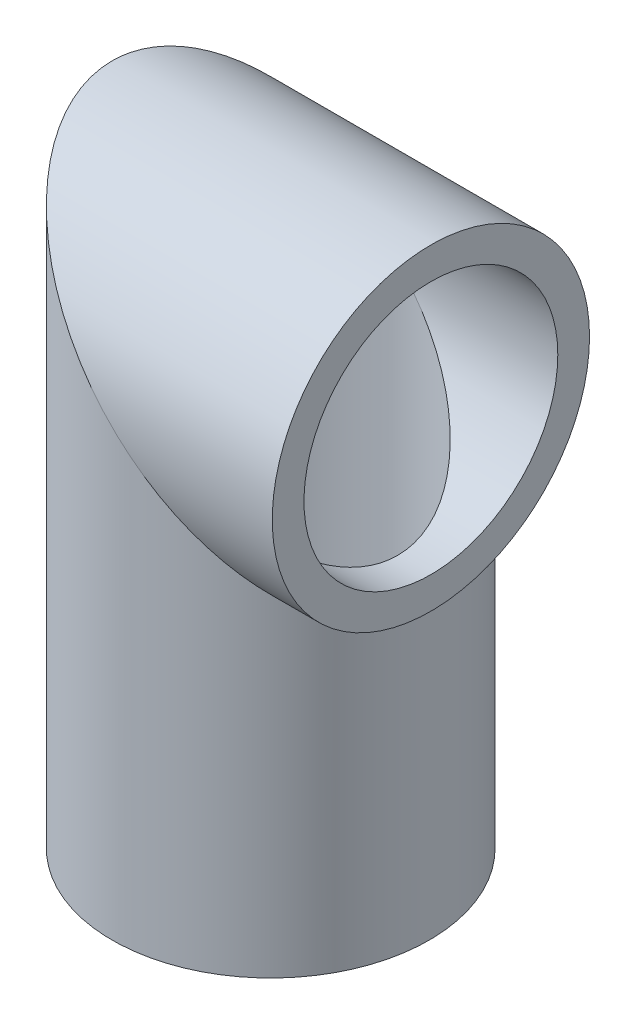
ISO-10303-21;
HEADER;
FILE_DESCRIPTION(('STEP AP214'),'2;1');
FILE_NAME('part.step','',(''),(''),'','','');
FILE_SCHEMA(('AUTOMOTIVE_DESIGN { 1 0 10303 214 1 1 1 1 }'));
ENDSEC;
DATA;
#1=APPLICATION_CONTEXT('core data for automotive mechanical design processes');
#2=APPLICATION_PROTOCOL_DEFINITION('international standard','automotive_design',2000,#1);
#3=PRODUCT_CONTEXT('',#1,'mechanical');
#4=PRODUCT('Part','Part','',(#3));
#5=PRODUCT_RELATED_PRODUCT_CATEGORY('part','',(#4));
#6=PRODUCT_DEFINITION_FORMATION('','',#4);
#7=PRODUCT_DEFINITION_CONTEXT('part definition',#1,'design');
#8=PRODUCT_DEFINITION('design','',#6,#7);
#9=PRODUCT_DEFINITION_SHAPE('','',#8);
#10=(LENGTH_UNIT() NAMED_UNIT(*) SI_UNIT(.MILLI.,.METRE.));
#11=(NAMED_UNIT(*) PLANE_ANGLE_UNIT() SI_UNIT($,.RADIAN.));
#12=(NAMED_UNIT(*) SI_UNIT($,.STERADIAN.) SOLID_ANGLE_UNIT());
#13=UNCERTAINTY_MEASURE_WITH_UNIT(LENGTH_MEASURE(1.E-05),#10,'distance_accuracy_value','');
#14=(GEOMETRIC_REPRESENTATION_CONTEXT(3) GLOBAL_UNCERTAINTY_ASSIGNED_CONTEXT((#13)) GLOBAL_UNIT_ASSIGNED_CONTEXT((#10,
#11,#12)) REPRESENTATION_CONTEXT('',''));
#15=CARTESIAN_POINT('',(0.,0.,0.));
#16=DIRECTION('',(0.,0.,1.));
#17=DIRECTION('',(1.,0.,0.));
#18=AXIS2_PLACEMENT_3D('',#15,#16,#17);
#19=CARTESIAN_POINT('',(12.62,0.,0.));
#20=DIRECTION('',(1.,0.,0.));
#21=DIRECTION('',(0.,0.,-1.));
#22=AXIS2_PLACEMENT_3D('',#19,#20,#21);
#23=PLANE('',#22);
#24=CARTESIAN_POINT('',(12.62,0.,0.));
#25=DIRECTION('',(1.,0.,0.));
#26=DIRECTION('',(0.,0.,-1.));
#27=AXIS2_PLACEMENT_3D('',#24,#25,#26);
#28=CIRCLE('',#27,10.);
#29=CARTESIAN_POINT('',(12.62,0.,-10.));
#30=VERTEX_POINT('',#29);
#31=EDGE_CURVE('E56',#30,#30,#28,.T.);
#32=ORIENTED_EDGE('',*,*,#31,.F.);
#33=EDGE_LOOP('',(#32));
#34=FACE_BOUND('',#33,.T.);
#35=CARTESIAN_POINT('',(12.62,0.,0.));
#36=DIRECTION('',(1.,0.,0.));
#37=DIRECTION('',(0.,0.,-1.));
#38=AXIS2_PLACEMENT_3D('',#35,#36,#37);
#39=CIRCLE('',#38,12.5);
#40=CARTESIAN_POINT('',(12.62,0.,-12.5));
#41=VERTEX_POINT('',#40);
#42=EDGE_CURVE('E40',#41,#41,#39,.T.);
#43=ORIENTED_EDGE('',*,*,#42,.T.);
#44=EDGE_LOOP('',(#43));
#45=FACE_BOUND('',#44,.T.);
#46=ADVANCED_FACE('F37',(#34,#45),#23,.T.);
#47=CARTESIAN_POINT('',(0.,-35.,0.));
#48=DIRECTION('',(0.,1.,0.));
#49=DIRECTION('',(0.,0.,-1.));
#50=AXIS2_PLACEMENT_3D('',#47,#48,#49);
#51=PLANE('',#50);
#52=CARTESIAN_POINT('',(0.,-35.,0.));
#53=DIRECTION('',(0.,1.,0.));
#54=DIRECTION('',(-1.,0.,0.));
#55=AXIS2_PLACEMENT_3D('',#52,#53,#54);
#56=CIRCLE('',#55,10.);
#57=CARTESIAN_POINT('',(-10.,-35.,0.));
#58=VERTEX_POINT('',#57);
#59=EDGE_CURVE('E52',#58,#58,#56,.T.);
#60=ORIENTED_EDGE('',*,*,#59,.T.);
#61=EDGE_LOOP('',(#60));
#62=FACE_BOUND('',#61,.T.);
#63=CARTESIAN_POINT('',(0.,-35.,0.));
#64=DIRECTION('',(0.,1.,0.));
#65=DIRECTION('',(0.,0.,-1.));
#66=AXIS2_PLACEMENT_3D('',#63,#64,#65);
#67=CIRCLE('',#66,12.5);
#68=CARTESIAN_POINT('',(0.,-35.,-12.5));
#69=VERTEX_POINT('',#68);
#70=EDGE_CURVE('E45',#69,#69,#67,.T.);
#71=ORIENTED_EDGE('',*,*,#70,.F.);
#72=EDGE_LOOP('',(#71));
#73=FACE_BOUND('',#72,.T.);
#74=ADVANCED_FACE('F85',(#62,#73),#51,.F.);
#75=CARTESIAN_POINT('',(-27.6,0.,0.));
#76=DIRECTION('',(1.,0.,0.));
#77=DIRECTION('',(0.,0.,-1.));
#78=AXIS2_PLACEMENT_3D('',#75,#76,#77);
#79=CYLINDRICAL_SURFACE('',#78,12.5);
#80=CARTESIAN_POINT('',(0.,0.,0.));
#81=DIRECTION('',(0.707106781186547,0.707106781186548,0.));
#82=DIRECTION('',(-0.707106781186548,0.707106781186547,0.));
#83=AXIS2_PLACEMENT_3D('',#80,#81,#82);
#84=ELLIPSE('',#83,17.6776695296637,12.5);
#85=CARTESIAN_POINT('',(-12.5,12.5,0.));
#86=VERTEX_POINT('',#85);
#87=EDGE_CURVE('E10',#86,#86,#84,.F.);
#88=ORIENTED_EDGE('',*,*,#87,.F.);
#89=EDGE_LOOP('',(#88));
#90=FACE_BOUND('',#89,.T.);
#91=ORIENTED_EDGE('',*,*,#42,.F.);
#92=EDGE_LOOP('',(#91));
#93=FACE_BOUND('',#92,.T.);
#94=ADVANCED_FACE('F79',(#90,#93),#79,.T.);
#95=CARTESIAN_POINT('',(0.,-35.,0.));
#96=DIRECTION('',(0.,1.,0.));
#97=DIRECTION('',(-1.,0.,0.));
#98=AXIS2_PLACEMENT_3D('',#95,#96,#97);
#99=CYLINDRICAL_SURFACE('',#98,12.5);
#100=ORIENTED_EDGE('',*,*,#70,.T.);
#101=EDGE_LOOP('',(#100));
#102=FACE_BOUND('',#101,.T.);
#103=ORIENTED_EDGE('',*,*,#87,.T.);
#104=EDGE_LOOP('',(#103));
#105=FACE_BOUND('',#104,.T.);
#106=ADVANCED_FACE('F75',(#102,#105),#99,.T.);
#107=CARTESIAN_POINT('',(13.62,0.,0.));
#108=DIRECTION('',(-1.,0.,0.));
#109=DIRECTION('',(0.,0.,1.));
#110=AXIS2_PLACEMENT_3D('',#107,#108,#109);
#111=CYLINDRICAL_SURFACE('',#110,10.);
#112=CARTESIAN_POINT('',(0.,0.,0.));
#113=DIRECTION('',(-0.707106781186547,-0.707106781186548,0.));
#114=DIRECTION('',(-0.707106781186548,0.707106781186547,0.));
#115=AXIS2_PLACEMENT_3D('',#112,#113,#114);
#116=ELLIPSE('',#115,14.142135623731,10.);
#117=CARTESIAN_POINT('',(-10.,10.,0.));
#118=VERTEX_POINT('',#117);
#119=EDGE_CURVE('E60',#118,#118,#116,.T.);
#120=ORIENTED_EDGE('',*,*,#119,.T.);
#121=EDGE_LOOP('',(#120));
#122=FACE_BOUND('',#121,.T.);
#123=ORIENTED_EDGE('',*,*,#31,.T.);
#124=EDGE_LOOP('',(#123));
#125=FACE_BOUND('',#124,.T.);
#126=ADVANCED_FACE('F65',(#122,#125),#111,.F.);
#127=CARTESIAN_POINT('',(0.,22.1,0.));
#128=DIRECTION('',(0.,-1.,0.));
#129=DIRECTION('',(1.,0.,0.));
#130=AXIS2_PLACEMENT_3D('',#127,#128,#129);
#131=CYLINDRICAL_SURFACE('',#130,10.);
#132=ORIENTED_EDGE('',*,*,#59,.F.);
#133=EDGE_LOOP('',(#132));
#134=FACE_BOUND('',#133,.T.);
#135=ORIENTED_EDGE('',*,*,#119,.F.);
#136=EDGE_LOOP('',(#135));
#137=FACE_BOUND('',#136,.T.);
#138=ADVANCED_FACE('F68',(#134,#137),#131,.F.);
#139=CLOSED_SHELL('',(#46,#74,#94,#106,#126,#138));
#140=MANIFOLD_SOLID_BREP('B2',#139);
#141=ADVANCED_BREP_SHAPE_REPRESENTATION('',(#18,#140),#14);
#142=SHAPE_DEFINITION_REPRESENTATION(#9,#141);
ENDSEC;
END-ISO-10303-21;
